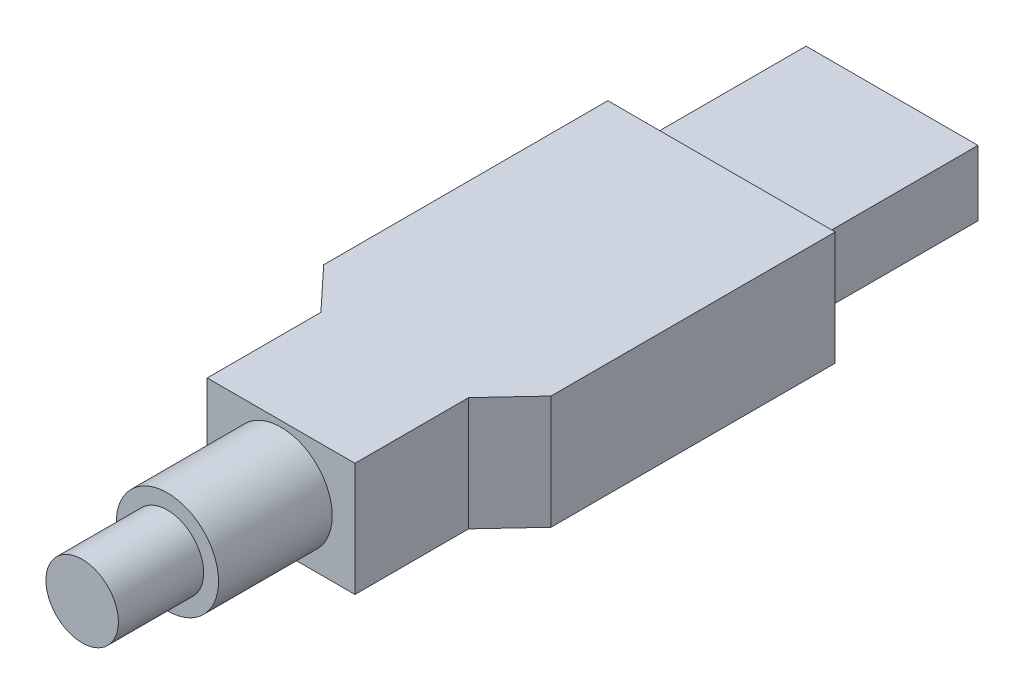
ISO-10303-21;
HEADER;
FILE_DESCRIPTION(('STEP AP214'),'2;1');
FILE_NAME('part.step','',(''),(''),'','','');
FILE_SCHEMA(('AUTOMOTIVE_DESIGN { 1 0 10303 214 1 1 1 1 }'));
ENDSEC;
DATA;
#1=APPLICATION_CONTEXT('core data for automotive mechanical design processes');
#2=APPLICATION_PROTOCOL_DEFINITION('international standard','automotive_design',2000,#1);
#3=PRODUCT_CONTEXT('',#1,'mechanical');
#4=PRODUCT('Part','Part','',(#3));
#5=PRODUCT_RELATED_PRODUCT_CATEGORY('part','',(#4));
#6=PRODUCT_DEFINITION_FORMATION('','',#4);
#7=PRODUCT_DEFINITION_CONTEXT('part definition',#1,'design');
#8=PRODUCT_DEFINITION('design','',#6,#7);
#9=PRODUCT_DEFINITION_SHAPE('','',#8);
#10=(LENGTH_UNIT() NAMED_UNIT(*) SI_UNIT(.MILLI.,.METRE.));
#11=(NAMED_UNIT(*) PLANE_ANGLE_UNIT() SI_UNIT($,.RADIAN.));
#12=(NAMED_UNIT(*) SI_UNIT($,.STERADIAN.) SOLID_ANGLE_UNIT());
#13=UNCERTAINTY_MEASURE_WITH_UNIT(LENGTH_MEASURE(1.E-05),#10,'distance_accuracy_value','');
#14=(GEOMETRIC_REPRESENTATION_CONTEXT(3) GLOBAL_UNCERTAINTY_ASSIGNED_CONTEXT((#13)) GLOBAL_UNIT_ASSIGNED_CONTEXT((#10,
#11,#12)) REPRESENTATION_CONTEXT('',''));
#15=CARTESIAN_POINT('',(0.,0.,0.));
#16=DIRECTION('',(0.,0.,1.));
#17=DIRECTION('',(1.,0.,0.));
#18=AXIS2_PLACEMENT_3D('',#15,#16,#17);
#19=CARTESIAN_POINT('',(-6.05,2.3,12.));
#20=DIRECTION('',(1.,0.,0.));
#21=DIRECTION('',(0.,0.,-1.));
#22=AXIS2_PLACEMENT_3D('',#19,#20,#21);
#23=PLANE('',#22);
#24=DIRECTION('',(0.,-1.,0.));
#25=VECTOR('',#24,1.);
#26=CARTESIAN_POINT('',(-6.05,2.3,0.));
#27=LINE('',#26,#25);
#28=CARTESIAN_POINT('',(-6.05,2.3,0.));
#29=VERTEX_POINT('',#28);
#30=CARTESIAN_POINT('',(-6.05,-2.3,0.));
#31=VERTEX_POINT('',#30);
#32=EDGE_CURVE('E242',#29,#31,#27,.T.);
#33=ORIENTED_EDGE('',*,*,#32,.T.);
#34=DIRECTION('',(0.,0.,-1.));
#35=VECTOR('',#34,1.);
#36=CARTESIAN_POINT('',(-6.05,-2.3,12.));
#37=LINE('',#36,#35);
#38=CARTESIAN_POINT('',(-6.05,-2.3,12.));
#39=VERTEX_POINT('',#38);
#40=EDGE_CURVE('E36',#39,#31,#37,.T.);
#41=ORIENTED_EDGE('',*,*,#40,.F.);
#42=DIRECTION('',(0.,-1.,0.));
#43=VECTOR('',#42,1.);
#44=CARTESIAN_POINT('',(-6.05,2.3,12.));
#45=LINE('',#44,#43);
#46=CARTESIAN_POINT('',(-6.05,2.3,12.));
#47=VERTEX_POINT('',#46);
#48=EDGE_CURVE('E249',#47,#39,#45,.T.);
#49=ORIENTED_EDGE('',*,*,#48,.F.);
#50=DIRECTION('',(0.,0.,-1.));
#51=VECTOR('',#50,1.);
#52=CARTESIAN_POINT('',(-6.05,2.3,12.));
#53=LINE('',#52,#51);
#54=EDGE_CURVE('E262',#47,#29,#53,.T.);
#55=ORIENTED_EDGE('',*,*,#54,.T.);
#56=EDGE_LOOP('',(#33,#41,#49,#55));
#57=FACE_BOUND('',#56,.T.);
#58=ADVANCED_FACE('F33',(#57),#23,.F.);
#59=CARTESIAN_POINT('',(-6.05,-2.3,12.));
#60=DIRECTION('',(0.,1.,0.));
#61=DIRECTION('',(-1.,0.,0.));
#62=AXIS2_PLACEMENT_3D('',#59,#60,#61);
#63=PLANE('',#62);
#64=DIRECTION('',(1.,0.,0.));
#65=VECTOR('',#64,1.);
#66=CARTESIAN_POINT('',(-6.05,-2.3,0.));
#67=LINE('',#66,#65);
#68=CARTESIAN_POINT('',(6.05,-2.3,0.));
#69=VERTEX_POINT('',#68);
#70=EDGE_CURVE('E265',#31,#69,#67,.T.);
#71=ORIENTED_EDGE('',*,*,#70,.T.);
#72=DIRECTION('',(0.,0.,-1.));
#73=VECTOR('',#72,1.);
#74=CARTESIAN_POINT('',(6.05,-2.3,12.));
#75=LINE('',#74,#73);
#76=CARTESIAN_POINT('',(6.05,-2.3,12.));
#77=VERTEX_POINT('',#76);
#78=EDGE_CURVE('E274',#77,#69,#75,.T.);
#79=ORIENTED_EDGE('',*,*,#78,.F.);
#80=DIRECTION('',(1.,0.,0.));
#81=VECTOR('',#80,1.);
#82=CARTESIAN_POINT('',(-6.05,-2.3,12.));
#83=LINE('',#82,#81);
#84=EDGE_CURVE('E252',#39,#77,#83,.T.);
#85=ORIENTED_EDGE('',*,*,#84,.F.);
#86=ORIENTED_EDGE('',*,*,#40,.T.);
#87=EDGE_LOOP('',(#71,#79,#85,#86));
#88=FACE_BOUND('',#87,.T.);
#89=ADVANCED_FACE('F321',(#88),#63,.F.);
#90=CARTESIAN_POINT('',(6.05,2.3,12.));
#91=DIRECTION('',(-1.,0.,0.));
#92=DIRECTION('',(0.,0.,1.));
#93=AXIS2_PLACEMENT_3D('',#90,#91,#92);
#94=PLANE('',#93);
#95=DIRECTION('',(0.,1.,0.));
#96=VECTOR('',#95,1.);
#97=CARTESIAN_POINT('',(6.05,2.3,0.));
#98=LINE('',#97,#96);
#99=CARTESIAN_POINT('',(6.05,2.3,0.));
#100=VERTEX_POINT('',#99);
#101=EDGE_CURVE('E267',#69,#100,#98,.T.);
#102=ORIENTED_EDGE('',*,*,#101,.T.);
#103=DIRECTION('',(0.,0.,-1.));
#104=VECTOR('',#103,1.);
#105=CARTESIAN_POINT('',(6.05,2.3,12.));
#106=LINE('',#105,#104);
#107=CARTESIAN_POINT('',(6.05,2.3,12.));
#108=VERTEX_POINT('',#107);
#109=EDGE_CURVE('E272',#108,#100,#106,.T.);
#110=ORIENTED_EDGE('',*,*,#109,.F.);
#111=DIRECTION('',(0.,1.,0.));
#112=VECTOR('',#111,1.);
#113=CARTESIAN_POINT('',(6.05,2.3,12.));
#114=LINE('',#113,#112);
#115=EDGE_CURVE('E256',#77,#108,#114,.T.);
#116=ORIENTED_EDGE('',*,*,#115,.F.);
#117=ORIENTED_EDGE('',*,*,#78,.T.);
#118=EDGE_LOOP('',(#102,#110,#116,#117));
#119=FACE_BOUND('',#118,.T.);
#120=ADVANCED_FACE('F326',(#119),#94,.F.);
#121=CARTESIAN_POINT('',(-6.05,2.3,12.));
#122=DIRECTION('',(0.,-1.,0.));
#123=DIRECTION('',(0.,0.,-1.));
#124=AXIS2_PLACEMENT_3D('',#121,#122,#123);
#125=PLANE('',#124);
#126=DIRECTION('',(-1.,0.,0.));
#127=VECTOR('',#126,1.);
#128=CARTESIAN_POINT('',(-6.05,2.3,0.));
#129=LINE('',#128,#127);
#130=EDGE_CURVE('E253',#100,#29,#129,.T.);
#131=ORIENTED_EDGE('',*,*,#130,.T.);
#132=ORIENTED_EDGE('',*,*,#54,.F.);
#133=DIRECTION('',(-1.,0.,0.));
#134=VECTOR('',#133,1.);
#135=CARTESIAN_POINT('',(-6.05,2.3,12.));
#136=LINE('',#135,#134);
#137=EDGE_CURVE('E259',#108,#47,#136,.T.);
#138=ORIENTED_EDGE('',*,*,#137,.F.);
#139=ORIENTED_EDGE('',*,*,#109,.T.);
#140=EDGE_LOOP('',(#131,#132,#138,#139));
#141=FACE_BOUND('',#140,.T.);
#142=ADVANCED_FACE('F334',(#141),#125,.F.);
#143=CARTESIAN_POINT('',(0.,0.,0.));
#144=DIRECTION('',(0.,0.,1.));
#145=DIRECTION('',(1.,0.,0.));
#146=AXIS2_PLACEMENT_3D('',#143,#144,#145);
#147=PLANE('',#146);
#148=DIRECTION('',(-1.,0.,0.));
#149=VECTOR('',#148,1.);
#150=CARTESIAN_POINT('',(5.75,-2.,0.));
#151=LINE('',#150,#149);
#152=CARTESIAN_POINT('',(5.75,-2.,0.));
#153=VERTEX_POINT('',#152);
#154=CARTESIAN_POINT('',(-5.75,-2.,0.));
#155=VERTEX_POINT('',#154);
#156=EDGE_CURVE('E232',#153,#155,#151,.T.);
#157=ORIENTED_EDGE('',*,*,#156,.F.);
#158=DIRECTION('',(0.,-1.,0.));
#159=VECTOR('',#158,1.);
#160=CARTESIAN_POINT('',(5.75,0.3,0.));
#161=LINE('',#160,#159);
#162=CARTESIAN_POINT('',(5.75,0.3,0.));
#163=VERTEX_POINT('',#162);
#164=EDGE_CURVE('E216',#163,#153,#161,.T.);
#165=ORIENTED_EDGE('',*,*,#164,.F.);
#166=DIRECTION('',(1.,0.,0.));
#167=VECTOR('',#166,1.);
#168=CARTESIAN_POINT('',(5.75,0.3,0.));
#169=LINE('',#168,#167);
#170=CARTESIAN_POINT('',(-5.75,0.3,0.));
#171=VERTEX_POINT('',#170);
#172=EDGE_CURVE('E221',#171,#163,#169,.T.);
#173=ORIENTED_EDGE('',*,*,#172,.F.);
#174=DIRECTION('',(0.,1.,0.));
#175=VECTOR('',#174,1.);
#176=CARTESIAN_POINT('',(-5.75,0.3,0.));
#177=LINE('',#176,#175);
#178=EDGE_CURVE('E235',#155,#171,#177,.T.);
#179=ORIENTED_EDGE('',*,*,#178,.F.);
#180=EDGE_LOOP('',(#157,#165,#173,#179));
#181=FACE_BOUND('',#180,.T.);
#182=ORIENTED_EDGE('',*,*,#32,.F.);
#183=ORIENTED_EDGE('',*,*,#130,.F.);
#184=ORIENTED_EDGE('',*,*,#101,.F.);
#185=ORIENTED_EDGE('',*,*,#70,.F.);
#186=EDGE_LOOP('',(#182,#183,#184,#185));
#187=FACE_BOUND('',#186,.T.);
#188=ADVANCED_FACE('F331',(#181,#187),#147,.F.);
#189=CARTESIAN_POINT('',(5.75,0.3,9.6));
#190=DIRECTION('',(1.,0.,0.));
#191=DIRECTION('',(0.,0.,-1.));
#192=AXIS2_PLACEMENT_3D('',#189,#190,#191);
#193=PLANE('',#192);
#194=ORIENTED_EDGE('',*,*,#164,.T.);
#195=DIRECTION('',(0.,0.,-1.));
#196=VECTOR('',#195,1.);
#197=CARTESIAN_POINT('',(5.75,-2.,9.6));
#198=LINE('',#197,#196);
#199=CARTESIAN_POINT('',(5.75,-2.,9.6));
#200=VERTEX_POINT('',#199);
#201=EDGE_CURVE('E230',#200,#153,#198,.T.);
#202=ORIENTED_EDGE('',*,*,#201,.F.);
#203=DIRECTION('',(0.,-1.,0.));
#204=VECTOR('',#203,1.);
#205=CARTESIAN_POINT('',(5.75,0.3,9.6));
#206=LINE('',#205,#204);
#207=CARTESIAN_POINT('',(5.75,0.3,9.6));
#208=VERTEX_POINT('',#207);
#209=EDGE_CURVE('E217',#208,#200,#206,.T.);
#210=ORIENTED_EDGE('',*,*,#209,.F.);
#211=DIRECTION('',(0.,0.,-1.));
#212=VECTOR('',#211,1.);
#213=CARTESIAN_POINT('',(5.75,0.3,9.6));
#214=LINE('',#213,#212);
#215=EDGE_CURVE('E240',#208,#163,#214,.T.);
#216=ORIENTED_EDGE('',*,*,#215,.T.);
#217=EDGE_LOOP('',(#194,#202,#210,#216));
#218=FACE_BOUND('',#217,.T.);
#219=ADVANCED_FACE('F341',(#218),#193,.F.);
#220=CARTESIAN_POINT('',(5.75,0.3,9.6));
#221=DIRECTION('',(0.,1.,0.));
#222=DIRECTION('',(0.,0.,1.));
#223=AXIS2_PLACEMENT_3D('',#220,#221,#222);
#224=PLANE('',#223);
#225=ORIENTED_EDGE('',*,*,#172,.T.);
#226=ORIENTED_EDGE('',*,*,#215,.F.);
#227=DIRECTION('',(1.,0.,0.));
#228=VECTOR('',#227,1.);
#229=CARTESIAN_POINT('',(5.75,0.3,9.6));
#230=LINE('',#229,#228);
#231=CARTESIAN_POINT('',(-5.75,0.3,9.6));
#232=VERTEX_POINT('',#231);
#233=EDGE_CURVE('E227',#232,#208,#230,.T.);
#234=ORIENTED_EDGE('',*,*,#233,.F.);
#235=DIRECTION('',(0.,0.,-1.));
#236=VECTOR('',#235,1.);
#237=CARTESIAN_POINT('',(-5.75,0.3,9.6));
#238=LINE('',#237,#236);
#239=EDGE_CURVE('E243',#232,#171,#238,.T.);
#240=ORIENTED_EDGE('',*,*,#239,.T.);
#241=EDGE_LOOP('',(#225,#226,#234,#240));
#242=FACE_BOUND('',#241,.T.);
#243=ADVANCED_FACE('F348',(#242),#224,.F.);
#244=CARTESIAN_POINT('',(-5.75,0.3,9.6));
#245=DIRECTION('',(-1.,0.,0.));
#246=DIRECTION('',(0.,0.,1.));
#247=AXIS2_PLACEMENT_3D('',#244,#245,#246);
#248=PLANE('',#247);
#249=ORIENTED_EDGE('',*,*,#178,.T.);
#250=ORIENTED_EDGE('',*,*,#239,.F.);
#251=DIRECTION('',(0.,1.,0.));
#252=VECTOR('',#251,1.);
#253=CARTESIAN_POINT('',(-5.75,0.3,9.6));
#254=LINE('',#253,#252);
#255=CARTESIAN_POINT('',(-5.75,-2.,9.6));
#256=VERTEX_POINT('',#255);
#257=EDGE_CURVE('E224',#256,#232,#254,.T.);
#258=ORIENTED_EDGE('',*,*,#257,.F.);
#259=DIRECTION('',(0.,0.,-1.));
#260=VECTOR('',#259,1.);
#261=CARTESIAN_POINT('',(-5.75,-2.,9.6));
#262=LINE('',#261,#260);
#263=EDGE_CURVE('E245',#256,#155,#262,.T.);
#264=ORIENTED_EDGE('',*,*,#263,.T.);
#265=EDGE_LOOP('',(#249,#250,#258,#264));
#266=FACE_BOUND('',#265,.T.);
#267=ADVANCED_FACE('F354',(#266),#248,.F.);
#268=CARTESIAN_POINT('',(5.75,-2.,9.6));
#269=DIRECTION('',(0.,-1.,0.));
#270=DIRECTION('',(0.,0.,-1.));
#271=AXIS2_PLACEMENT_3D('',#268,#269,#270);
#272=PLANE('',#271);
#273=ORIENTED_EDGE('',*,*,#156,.T.);
#274=ORIENTED_EDGE('',*,*,#263,.F.);
#275=DIRECTION('',(-1.,0.,0.));
#276=VECTOR('',#275,1.);
#277=CARTESIAN_POINT('',(5.75,-2.,9.6));
#278=LINE('',#277,#276);
#279=EDGE_CURVE('E220',#200,#256,#278,.T.);
#280=ORIENTED_EDGE('',*,*,#279,.F.);
#281=ORIENTED_EDGE('',*,*,#201,.T.);
#282=EDGE_LOOP('',(#273,#274,#280,#281));
#283=FACE_BOUND('',#282,.T.);
#284=ADVANCED_FACE('F350',(#283),#272,.F.);
#285=CARTESIAN_POINT('',(0.,0.,9.6));
#286=DIRECTION('',(0.,0.,-1.));
#287=DIRECTION('',(-1.,0.,0.));
#288=AXIS2_PLACEMENT_3D('',#285,#286,#287);
#289=PLANE('',#288);
#290=ORIENTED_EDGE('',*,*,#209,.T.);
#291=ORIENTED_EDGE('',*,*,#279,.T.);
#292=ORIENTED_EDGE('',*,*,#257,.T.);
#293=ORIENTED_EDGE('',*,*,#233,.T.);
#294=EDGE_LOOP('',(#290,#291,#292,#293));
#295=FACE_BOUND('',#294,.T.);
#296=ADVANCED_FACE('F353',(#295),#289,.T.);
#297=CARTESIAN_POINT('',(0.,0.,12.));
#298=DIRECTION('',(0.,0.,1.));
#299=DIRECTION('',(1.,0.,0.));
#300=AXIS2_PLACEMENT_3D('',#297,#298,#299);
#301=PLANE('',#300);
#302=DIRECTION('',(0.,-1.,0.));
#303=VECTOR('',#302,1.);
#304=CARTESIAN_POINT('',(-8.,4.,12.));
#305=LINE('',#304,#303);
#306=CARTESIAN_POINT('',(-8.,4.,12.));
#307=VERTEX_POINT('',#306);
#308=CARTESIAN_POINT('',(-8.,-4.,12.));
#309=VERTEX_POINT('',#308);
#310=EDGE_CURVE('E175',#307,#309,#305,.T.);
#311=ORIENTED_EDGE('',*,*,#310,.F.);
#312=DIRECTION('',(-1.,0.,0.));
#313=VECTOR('',#312,1.);
#314=CARTESIAN_POINT('',(-8.,4.,12.));
#315=LINE('',#314,#313);
#316=CARTESIAN_POINT('',(8.,4.,12.));
#317=VERTEX_POINT('',#316);
#318=EDGE_CURVE('E195',#317,#307,#315,.T.);
#319=ORIENTED_EDGE('',*,*,#318,.F.);
#320=DIRECTION('',(0.,1.,0.));
#321=VECTOR('',#320,1.);
#322=CARTESIAN_POINT('',(8.,4.,12.));
#323=LINE('',#322,#321);
#324=CARTESIAN_POINT('',(8.,-4.,12.));
#325=VERTEX_POINT('',#324);
#326=EDGE_CURVE('E204',#325,#317,#323,.T.);
#327=ORIENTED_EDGE('',*,*,#326,.F.);
#328=DIRECTION('',(1.,0.,0.));
#329=VECTOR('',#328,1.);
#330=CARTESIAN_POINT('',(-8.,-4.,12.));
#331=LINE('',#330,#329);
#332=EDGE_CURVE('E201',#309,#325,#331,.T.);
#333=ORIENTED_EDGE('',*,*,#332,.F.);
#334=EDGE_LOOP('',(#311,#319,#327,#333));
#335=FACE_BOUND('',#334,.T.);
#336=ORIENTED_EDGE('',*,*,#137,.T.);
#337=ORIENTED_EDGE('',*,*,#48,.T.);
#338=ORIENTED_EDGE('',*,*,#84,.T.);
#339=ORIENTED_EDGE('',*,*,#115,.T.);
#340=EDGE_LOOP('',(#336,#337,#338,#339));
#341=FACE_BOUND('',#340,.T.);
#342=ADVANCED_FACE('F303',(#335,#341),#301,.F.);
#343=CARTESIAN_POINT('',(-8.,4.,43.));
#344=DIRECTION('',(1.,0.,0.));
#345=DIRECTION('',(0.,0.,-1.));
#346=AXIS2_PLACEMENT_3D('',#343,#344,#345);
#347=PLANE('',#346);
#348=DIRECTION('',(0.,0.,-1.));
#349=VECTOR('',#348,1.);
#350=CARTESIAN_POINT('',(-8.,-4.,43.));
#351=LINE('',#350,#349);
#352=CARTESIAN_POINT('',(-8.,-4.,32.));
#353=VERTEX_POINT('',#352);
#354=EDGE_CURVE('E214',#353,#309,#351,.T.);
#355=ORIENTED_EDGE('',*,*,#354,.F.);
#356=DIRECTION('',(0.,1.,0.));
#357=VECTOR('',#356,1.);
#358=CARTESIAN_POINT('',(-8.,-4.,32.));
#359=LINE('',#358,#357);
#360=CARTESIAN_POINT('',(-8.,4.,32.));
#361=VERTEX_POINT('',#360);
#362=EDGE_CURVE('E152',#353,#361,#359,.T.);
#363=ORIENTED_EDGE('',*,*,#362,.T.);
#364=DIRECTION('',(0.,0.,-1.));
#365=VECTOR('',#364,1.);
#366=CARTESIAN_POINT('',(-8.,4.,43.));
#367=LINE('',#366,#365);
#368=EDGE_CURVE('E198',#361,#307,#367,.T.);
#369=ORIENTED_EDGE('',*,*,#368,.T.);
#370=ORIENTED_EDGE('',*,*,#310,.T.);
#371=EDGE_LOOP('',(#355,#363,#369,#370));
#372=FACE_BOUND('',#371,.T.);
#373=ADVANCED_FACE('F297',(#372),#347,.F.);
#374=CARTESIAN_POINT('',(-8.,-4.,43.));
#375=DIRECTION('',(0.,1.,0.));
#376=DIRECTION('',(-1.,0.,0.));
#377=AXIS2_PLACEMENT_3D('',#374,#375,#376);
#378=PLANE('',#377);
#379=DIRECTION('',(0.,0.,-1.));
#380=VECTOR('',#379,1.);
#381=CARTESIAN_POINT('',(-5.2,-4.,35.));
#382=LINE('',#381,#380);
#383=CARTESIAN_POINT('',(-5.2,-4.,43.));
#384=VERTEX_POINT('',#383);
#385=CARTESIAN_POINT('',(-5.2,-4.,35.));
#386=VERTEX_POINT('',#385);
#387=EDGE_CURVE('E57',#384,#386,#382,.T.);
#388=ORIENTED_EDGE('',*,*,#387,.T.);
#389=DIRECTION('',(-0.682318250360011,0.,-0.731055268242869));
#390=VECTOR('',#389,1.);
#391=CARTESIAN_POINT('',(-8.,-4.,32.));
#392=LINE('',#391,#390);
#393=EDGE_CURVE('E156',#386,#353,#392,.T.);
#394=ORIENTED_EDGE('',*,*,#393,.T.);
#395=ORIENTED_EDGE('',*,*,#354,.T.);
#396=ORIENTED_EDGE('',*,*,#332,.T.);
#397=DIRECTION('',(0.,0.,-1.));
#398=VECTOR('',#397,1.);
#399=CARTESIAN_POINT('',(8.,-4.,43.));
#400=LINE('',#399,#398);
#401=CARTESIAN_POINT('',(8.00000000000001,-4.,32.));
#402=VERTEX_POINT('',#401);
#403=EDGE_CURVE('E212',#402,#325,#400,.T.);
#404=ORIENTED_EDGE('',*,*,#403,.F.);
#405=DIRECTION('',(-0.682318250360011,0.,0.73105526824287));
#406=VECTOR('',#405,1.);
#407=CARTESIAN_POINT('',(8.00000000000001,-4.,32.));
#408=LINE('',#407,#406);
#409=CARTESIAN_POINT('',(5.20000000000001,-4.,35.));
#410=VERTEX_POINT('',#409);
#411=EDGE_CURVE('E180',#402,#410,#408,.T.);
#412=ORIENTED_EDGE('',*,*,#411,.T.);
#413=DIRECTION('',(0.,0.,1.));
#414=VECTOR('',#413,1.);
#415=CARTESIAN_POINT('',(5.20000000000001,-4.,35.));
#416=LINE('',#415,#414);
#417=CARTESIAN_POINT('',(5.20000000000001,-4.,43.));
#418=VERTEX_POINT('',#417);
#419=EDGE_CURVE('E178',#410,#418,#416,.T.);
#420=ORIENTED_EDGE('',*,*,#419,.T.);
#421=DIRECTION('',(1.,0.,0.));
#422=VECTOR('',#421,1.);
#423=CARTESIAN_POINT('',(-8.,-4.,43.));
#424=LINE('',#423,#422);
#425=EDGE_CURVE('E166',#384,#418,#424,.T.);
#426=ORIENTED_EDGE('',*,*,#425,.F.);
#427=EDGE_LOOP('',(#388,#394,#395,#396,#404,#412,#420,#426));
#428=FACE_BOUND('',#427,.T.);
#429=ADVANCED_FACE('F163',(#428),#378,.F.);
#430=CARTESIAN_POINT('',(8.,4.,43.));
#431=DIRECTION('',(-1.,0.,0.));
#432=DIRECTION('',(0.,0.,1.));
#433=AXIS2_PLACEMENT_3D('',#430,#431,#432);
#434=PLANE('',#433);
#435=DIRECTION('',(0.,0.,-1.));
#436=VECTOR('',#435,1.);
#437=CARTESIAN_POINT('',(8.,4.,43.));
#438=LINE('',#437,#436);
#439=CARTESIAN_POINT('',(8.00000000000001,4.,32.));
#440=VERTEX_POINT('',#439);
#441=EDGE_CURVE('E210',#440,#317,#438,.T.);
#442=ORIENTED_EDGE('',*,*,#441,.F.);
#443=DIRECTION('',(0.,1.,0.));
#444=VECTOR('',#443,1.);
#445=CARTESIAN_POINT('',(8.00000000000001,-4.,32.));
#446=LINE('',#445,#444);
#447=EDGE_CURVE('E190',#402,#440,#446,.T.);
#448=ORIENTED_EDGE('',*,*,#447,.F.);
#449=ORIENTED_EDGE('',*,*,#403,.T.);
#450=ORIENTED_EDGE('',*,*,#326,.T.);
#451=EDGE_LOOP('',(#442,#448,#449,#450));
#452=FACE_BOUND('',#451,.T.);
#453=ADVANCED_FACE('F308',(#452),#434,.F.);
#454=CARTESIAN_POINT('',(-8.,4.,43.));
#455=DIRECTION('',(0.,-1.,0.));
#456=DIRECTION('',(0.,0.,-1.));
#457=AXIS2_PLACEMENT_3D('',#454,#455,#456);
#458=PLANE('',#457);
#459=ORIENTED_EDGE('',*,*,#368,.F.);
#460=DIRECTION('',(-0.682318250360011,0.,-0.731055268242869));
#461=VECTOR('',#460,1.);
#462=CARTESIAN_POINT('',(-8.,4.,32.));
#463=LINE('',#462,#461);
#464=CARTESIAN_POINT('',(-5.2,4.,35.));
#465=VERTEX_POINT('',#464);
#466=EDGE_CURVE('E167',#465,#361,#463,.T.);
#467=ORIENTED_EDGE('',*,*,#466,.F.);
#468=DIRECTION('',(0.,0.,-1.));
#469=VECTOR('',#468,1.);
#470=CARTESIAN_POINT('',(-5.2,4.,35.));
#471=LINE('',#470,#469);
#472=CARTESIAN_POINT('',(-5.2,4.,43.));
#473=VERTEX_POINT('',#472);
#474=EDGE_CURVE('E149',#473,#465,#471,.T.);
#475=ORIENTED_EDGE('',*,*,#474,.F.);
#476=DIRECTION('',(-1.,0.,0.));
#477=VECTOR('',#476,1.);
#478=CARTESIAN_POINT('',(-8.,4.,43.));
#479=LINE('',#478,#477);
#480=CARTESIAN_POINT('',(5.20000000000001,4.,43.));
#481=VERTEX_POINT('',#480);
#482=EDGE_CURVE('E194',#481,#473,#479,.T.);
#483=ORIENTED_EDGE('',*,*,#482,.F.);
#484=DIRECTION('',(0.,0.,1.));
#485=VECTOR('',#484,1.);
#486=CARTESIAN_POINT('',(5.20000000000001,4.,35.));
#487=LINE('',#486,#485);
#488=CARTESIAN_POINT('',(5.20000000000001,4.,35.));
#489=VERTEX_POINT('',#488);
#490=EDGE_CURVE('E49',#489,#481,#487,.T.);
#491=ORIENTED_EDGE('',*,*,#490,.F.);
#492=DIRECTION('',(-0.682318250360011,0.,0.73105526824287));
#493=VECTOR('',#492,1.);
#494=CARTESIAN_POINT('',(8.00000000000001,4.,32.));
#495=LINE('',#494,#493);
#496=EDGE_CURVE('E181',#440,#489,#495,.T.);
#497=ORIENTED_EDGE('',*,*,#496,.F.);
#498=ORIENTED_EDGE('',*,*,#441,.T.);
#499=ORIENTED_EDGE('',*,*,#318,.T.);
#500=EDGE_LOOP('',(#459,#467,#475,#483,#491,#497,#498,#499));
#501=FACE_BOUND('',#500,.T.);
#502=ADVANCED_FACE('F291',(#501),#458,.F.);
#503=CARTESIAN_POINT('',(0.,0.,43.));
#504=DIRECTION('',(0.,0.,1.));
#505=DIRECTION('',(1.,0.,0.));
#506=AXIS2_PLACEMENT_3D('',#503,#504,#505);
#507=PLANE('',#506);
#508=CARTESIAN_POINT('',(0.,0.,43.));
#509=DIRECTION('',(0.,0.,1.));
#510=DIRECTION('',(1.,0.,0.));
#511=AXIS2_PLACEMENT_3D('',#508,#509,#510);
#512=CIRCLE('',#511,3.6);
#513=CARTESIAN_POINT('',(3.6,0.,43.));
#514=VERTEX_POINT('',#513);
#515=EDGE_CURVE('E41',#514,#514,#512,.T.);
#516=ORIENTED_EDGE('',*,*,#515,.F.);
#517=EDGE_LOOP('',(#516));
#518=FACE_BOUND('',#517,.T.);
#519=DIRECTION('',(0.,1.,0.));
#520=VECTOR('',#519,1.);
#521=CARTESIAN_POINT('',(-5.2,-4.,43.));
#522=LINE('',#521,#520);
#523=EDGE_CURVE('E153',#384,#473,#522,.T.);
#524=ORIENTED_EDGE('',*,*,#523,.F.);
#525=ORIENTED_EDGE('',*,*,#425,.T.);
#526=DIRECTION('',(0.,1.,0.));
#527=VECTOR('',#526,1.);
#528=CARTESIAN_POINT('',(5.20000000000001,-4.,43.));
#529=LINE('',#528,#527);
#530=EDGE_CURVE('E184',#418,#481,#529,.T.);
#531=ORIENTED_EDGE('',*,*,#530,.T.);
#532=ORIENTED_EDGE('',*,*,#482,.T.);
#533=EDGE_LOOP('',(#524,#525,#531,#532));
#534=FACE_BOUND('',#533,.T.);
#535=ADVANCED_FACE('F287',(#518,#534),#507,.T.);
#536=CARTESIAN_POINT('',(5.20000000000001,-4.,35.));
#537=DIRECTION('',(-1.,0.,0.));
#538=DIRECTION('',(0.,0.,1.));
#539=AXIS2_PLACEMENT_3D('',#536,#537,#538);
#540=PLANE('',#539);
#541=ORIENTED_EDGE('',*,*,#490,.T.);
#542=ORIENTED_EDGE('',*,*,#530,.F.);
#543=ORIENTED_EDGE('',*,*,#419,.F.);
#544=DIRECTION('',(0.,1.,0.));
#545=VECTOR('',#544,1.);
#546=CARTESIAN_POINT('',(5.20000000000001,-4.,35.));
#547=LINE('',#546,#545);
#548=EDGE_CURVE('E173',#410,#489,#547,.T.);
#549=ORIENTED_EDGE('',*,*,#548,.T.);
#550=EDGE_LOOP('',(#541,#542,#543,#549));
#551=FACE_BOUND('',#550,.T.);
#552=ADVANCED_FACE('F290',(#551),#540,.F.);
#553=CARTESIAN_POINT('',(8.00000000000001,-4.,32.));
#554=DIRECTION('',(-0.73105526824287,0.,-0.682318250360011));
#555=DIRECTION('',(-0.682318250360011,0.,0.73105526824287));
#556=AXIS2_PLACEMENT_3D('',#553,#554,#555);
#557=PLANE('',#556);
#558=ORIENTED_EDGE('',*,*,#496,.T.);
#559=ORIENTED_EDGE('',*,*,#548,.F.);
#560=ORIENTED_EDGE('',*,*,#411,.F.);
#561=ORIENTED_EDGE('',*,*,#447,.T.);
#562=EDGE_LOOP('',(#558,#559,#560,#561));
#563=FACE_BOUND('',#562,.T.);
#564=ADVANCED_FACE('F312',(#563),#557,.F.);
#565=CARTESIAN_POINT('',(-8.,-4.,32.));
#566=DIRECTION('',(0.731055268242869,0.,-0.682318250360011));
#567=DIRECTION('',(-0.682318250360011,0.,-0.731055268242869));
#568=AXIS2_PLACEMENT_3D('',#565,#566,#567);
#569=PLANE('',#568);
#570=ORIENTED_EDGE('',*,*,#466,.T.);
#571=ORIENTED_EDGE('',*,*,#362,.F.);
#572=ORIENTED_EDGE('',*,*,#393,.F.);
#573=DIRECTION('',(0.,1.,0.));
#574=VECTOR('',#573,1.);
#575=CARTESIAN_POINT('',(-5.2,-4.,35.));
#576=LINE('',#575,#574);
#577=EDGE_CURVE('E145',#386,#465,#576,.T.);
#578=ORIENTED_EDGE('',*,*,#577,.T.);
#579=EDGE_LOOP('',(#570,#571,#572,#578));
#580=FACE_BOUND('',#579,.T.);
#581=ADVANCED_FACE('F157',(#580),#569,.F.);
#582=CARTESIAN_POINT('',(-5.2,-4.,35.));
#583=DIRECTION('',(1.,0.,0.));
#584=DIRECTION('',(0.,0.,-1.));
#585=AXIS2_PLACEMENT_3D('',#582,#583,#584);
#586=PLANE('',#585);
#587=ORIENTED_EDGE('',*,*,#474,.T.);
#588=ORIENTED_EDGE('',*,*,#577,.F.);
#589=ORIENTED_EDGE('',*,*,#387,.F.);
#590=ORIENTED_EDGE('',*,*,#523,.T.);
#591=EDGE_LOOP('',(#587,#588,#589,#590));
#592=FACE_BOUND('',#591,.T.);
#593=ADVANCED_FACE('F147',(#592),#586,.F.);
#594=CARTESIAN_POINT('',(0.,0.,51.));
#595=DIRECTION('',(0.,0.,-1.));
#596=DIRECTION('',(-1.,0.,0.));
#597=AXIS2_PLACEMENT_3D('',#594,#595,#596);
#598=CYLINDRICAL_SURFACE('',#597,3.6);
#599=CARTESIAN_POINT('',(0.,0.,51.));
#600=DIRECTION('',(0.,0.,1.));
#601=DIRECTION('',(1.,0.,0.));
#602=AXIS2_PLACEMENT_3D('',#599,#600,#601);
#603=CIRCLE('',#602,3.6);
#604=CARTESIAN_POINT('',(3.6,0.,51.));
#605=VERTEX_POINT('',#604);
#606=EDGE_CURVE('E186',#605,#605,#603,.T.);
#607=ORIENTED_EDGE('',*,*,#606,.F.);
#608=EDGE_LOOP('',(#607));
#609=FACE_BOUND('',#608,.T.);
#610=ORIENTED_EDGE('',*,*,#515,.T.);
#611=EDGE_LOOP('',(#610));
#612=FACE_BOUND('',#611,.T.);
#613=ADVANCED_FACE('F285',(#609,#612),#598,.T.);
#614=CARTESIAN_POINT('',(0.,0.,51.));
#615=DIRECTION('',(0.,0.,1.));
#616=DIRECTION('',(1.,0.,0.));
#617=AXIS2_PLACEMENT_3D('',#614,#615,#616);
#618=PLANE('',#617);
#619=CARTESIAN_POINT('',(0.,0.,51.));
#620=DIRECTION('',(0.,0.,1.));
#621=DIRECTION('',(1.,0.,0.));
#622=AXIS2_PLACEMENT_3D('',#619,#620,#621);
#623=CIRCLE('',#622,2.55);
#624=CARTESIAN_POINT('',(2.55,0.,51.));
#625=VERTEX_POINT('',#624);
#626=EDGE_CURVE('E11',#625,#625,#623,.T.);
#627=ORIENTED_EDGE('',*,*,#626,.F.);
#628=EDGE_LOOP('',(#627));
#629=FACE_BOUND('',#628,.T.);
#630=ORIENTED_EDGE('',*,*,#606,.T.);
#631=EDGE_LOOP('',(#630));
#632=FACE_BOUND('',#631,.T.);
#633=ADVANCED_FACE('F413',(#629,#632),#618,.T.);
#634=CARTESIAN_POINT('',(0.,0.,57.));
#635=DIRECTION('',(0.,0.,-1.));
#636=DIRECTION('',(-1.,0.,0.));
#637=AXIS2_PLACEMENT_3D('',#634,#635,#636);
#638=CYLINDRICAL_SURFACE('',#637,2.55);
#639=CARTESIAN_POINT('',(0.,0.,57.));
#640=DIRECTION('',(0.,0.,1.));
#641=DIRECTION('',(1.,0.,0.));
#642=AXIS2_PLACEMENT_3D('',#639,#640,#641);
#643=CIRCLE('',#642,2.55);
#644=CARTESIAN_POINT('',(2.55,0.,57.));
#645=VERTEX_POINT('',#644);
#646=EDGE_CURVE('E469',#645,#645,#643,.T.);
#647=ORIENTED_EDGE('',*,*,#646,.F.);
#648=EDGE_LOOP('',(#647));
#649=FACE_BOUND('',#648,.T.);
#650=ORIENTED_EDGE('',*,*,#626,.T.);
#651=EDGE_LOOP('',(#650));
#652=FACE_BOUND('',#651,.T.);
#653=ADVANCED_FACE('F423',(#649,#652),#638,.T.);
#654=CARTESIAN_POINT('',(0.,0.,57.));
#655=DIRECTION('',(0.,0.,1.));
#656=DIRECTION('',(1.,0.,0.));
#657=AXIS2_PLACEMENT_3D('',#654,#655,#656);
#658=PLANE('',#657);
#659=ORIENTED_EDGE('',*,*,#646,.T.);
#660=EDGE_LOOP('',(#659));
#661=FACE_BOUND('',#660,.T.);
#662=ADVANCED_FACE('F433',(#661),#658,.T.);
#663=CLOSED_SHELL('',(#58,#89,#120,#142,#188,#219,#243,#267,#284,#296,#342,#373,#429,#453,#502,
#535,#552,#564,#581,#593,#613,#633,#653,#662));
#664=MANIFOLD_SOLID_BREP('B2',#663);
#665=ADVANCED_BREP_SHAPE_REPRESENTATION('',(#18,#664),#14);
#666=SHAPE_DEFINITION_REPRESENTATION(#9,#665);
ENDSEC;
END-ISO-10303-21;
